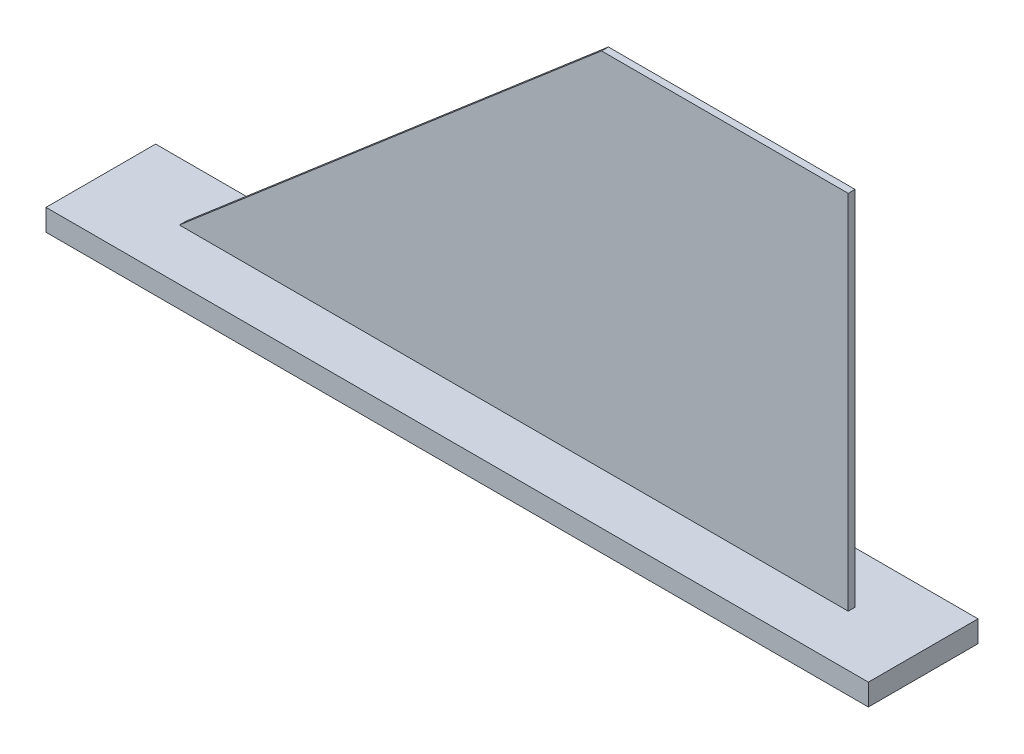
ISO-10303-21;
HEADER;
FILE_DESCRIPTION(('STEP AP214'),'2;1');
FILE_NAME('part.step','',(''),(''),'','','');
FILE_SCHEMA(('AUTOMOTIVE_DESIGN { 1 0 10303 214 1 1 1 1 }'));
ENDSEC;
DATA;
#1=APPLICATION_CONTEXT('core data for automotive mechanical design processes');
#2=APPLICATION_PROTOCOL_DEFINITION('international standard','automotive_design',2000,#1);
#3=PRODUCT_CONTEXT('',#1,'mechanical');
#4=PRODUCT('Part','Part','',(#3));
#5=PRODUCT_RELATED_PRODUCT_CATEGORY('part','',(#4));
#6=PRODUCT_DEFINITION_FORMATION('','',#4);
#7=PRODUCT_DEFINITION_CONTEXT('part definition',#1,'design');
#8=PRODUCT_DEFINITION('design','',#6,#7);
#9=PRODUCT_DEFINITION_SHAPE('','',#8);
#10=(LENGTH_UNIT() NAMED_UNIT(*) SI_UNIT(.MILLI.,.METRE.));
#11=(NAMED_UNIT(*) PLANE_ANGLE_UNIT() SI_UNIT($,.RADIAN.));
#12=(NAMED_UNIT(*) SI_UNIT($,.STERADIAN.) SOLID_ANGLE_UNIT());
#13=UNCERTAINTY_MEASURE_WITH_UNIT(LENGTH_MEASURE(1.E-05),#10,'distance_accuracy_value','');
#14=(GEOMETRIC_REPRESENTATION_CONTEXT(3) GLOBAL_UNCERTAINTY_ASSIGNED_CONTEXT((#13)) GLOBAL_UNIT_ASSIGNED_CONTEXT((#10,
#11,#12)) REPRESENTATION_CONTEXT('',''));
#15=CARTESIAN_POINT('',(0.,0.,0.));
#16=DIRECTION('',(0.,0.,1.));
#17=DIRECTION('',(1.,0.,0.));
#18=AXIS2_PLACEMENT_3D('',#15,#16,#17);
#19=CARTESIAN_POINT('',(347.8679657213,177.64,-26.9875));
#20=DIRECTION('',(1.,0.,0.));
#21=DIRECTION('',(0.,0.,-1.));
#22=AXIS2_PLACEMENT_3D('',#19,#20,#21);
#23=PLANE('',#22);
#24=DIRECTION('',(0.,0.,1.));
#25=VECTOR('',#24,1.);
#26=CARTESIAN_POINT('',(347.8679657213,177.64,-26.9875));
#27=LINE('',#26,#25);
#28=CARTESIAN_POINT('',(347.8679657213,177.64,-26.9875));
#29=VERTEX_POINT('',#28);
#30=CARTESIAN_POINT('',(347.8679657213,177.64,-23.8125));
#31=VERTEX_POINT('',#30);
#32=EDGE_CURVE('E54',#29,#31,#27,.T.);
#33=ORIENTED_EDGE('',*,*,#32,.T.);
#34=DIRECTION('',(0.,1.,0.));
#35=VECTOR('',#34,1.);
#36=CARTESIAN_POINT('',(347.8679657213,177.64,-23.8125));
#37=LINE('',#36,#35);
#38=CARTESIAN_POINT('',(347.8679657213,10.,-23.8125));
#39=VERTEX_POINT('',#38);
#40=EDGE_CURVE('E92',#39,#31,#37,.T.);
#41=ORIENTED_EDGE('',*,*,#40,.F.);
#42=DIRECTION('',(0.,0.,1.));
#43=VECTOR('',#42,1.);
#44=CARTESIAN_POINT('',(347.8679657213,10.,-26.9875));
#45=LINE('',#44,#43);
#46=CARTESIAN_POINT('',(347.8679657213,10.,-26.9875));
#47=VERTEX_POINT('',#46);
#48=EDGE_CURVE('E12',#47,#39,#45,.T.);
#49=ORIENTED_EDGE('',*,*,#48,.F.);
#50=DIRECTION('',(0.,1.,0.));
#51=VECTOR('',#50,1.);
#52=CARTESIAN_POINT('',(347.8679657213,177.64,-26.9875));
#53=LINE('',#52,#51);
#54=EDGE_CURVE('E93',#47,#29,#53,.T.);
#55=ORIENTED_EDGE('',*,*,#54,.T.);
#56=EDGE_LOOP('',(#33,#41,#49,#55));
#57=FACE_BOUND('',#56,.T.);
#58=ADVANCED_FACE('F51',(#57),#23,.T.);
#59=CARTESIAN_POINT('',(347.8679657213,10.,-26.9875));
#60=DIRECTION('',(0.,-1.,0.));
#61=DIRECTION('',(1.,0.,0.));
#62=AXIS2_PLACEMENT_3D('',#59,#60,#61);
#63=PLANE('',#62);
#64=ORIENTED_EDGE('',*,*,#48,.T.);
#65=DIRECTION('',(1.,0.,0.));
#66=VECTOR('',#65,1.);
#67=CARTESIAN_POINT('',(347.8679657213,10.,-23.8125));
#68=LINE('',#67,#66);
#69=CARTESIAN_POINT('',(37.9879657212996,10.,-23.8125));
#70=VERTEX_POINT('',#69);
#71=EDGE_CURVE('E111',#70,#39,#68,.T.);
#72=ORIENTED_EDGE('',*,*,#71,.F.);
#73=DIRECTION('',(0.,0.,1.));
#74=VECTOR('',#73,1.);
#75=CARTESIAN_POINT('',(37.9879657212996,10.,-26.9875));
#76=LINE('',#75,#74);
#77=CARTESIAN_POINT('',(37.9879657212996,10.,-26.9875));
#78=VERTEX_POINT('',#77);
#79=EDGE_CURVE('E60',#78,#70,#76,.T.);
#80=ORIENTED_EDGE('',*,*,#79,.F.);
#81=DIRECTION('',(1.,0.,0.));
#82=VECTOR('',#81,1.);
#83=CARTESIAN_POINT('',(347.8679657213,10.,-26.9875));
#84=LINE('',#83,#82);
#85=EDGE_CURVE('E99',#78,#47,#84,.T.);
#86=ORIENTED_EDGE('',*,*,#85,.T.);
#87=EDGE_LOOP('',(#64,#72,#80,#86));
#88=FACE_BOUND('',#87,.T.);
#89=ADVANCED_FACE('F135',(#88),#63,.T.);
#90=CARTESIAN_POINT('',(37.9879657212996,10.,-26.9875));
#91=DIRECTION('',(-0.650791373455968,0.759256602365296,0.));
#92=DIRECTION('',(-0.759256602365297,-0.650791373455969,0.));
#93=AXIS2_PLACEMENT_3D('',#90,#91,#92);
#94=PLANE('',#93);
#95=ORIENTED_EDGE('',*,*,#79,.T.);
#96=DIRECTION('',(-0.759256602365297,-0.650791373455969,0.));
#97=VECTOR('',#96,1.);
#98=CARTESIAN_POINT('',(37.9879657212996,10.,-23.8125));
#99=LINE('',#98,#97);
#100=CARTESIAN_POINT('',(233.5679657213,177.64,-23.8125));
#101=VERTEX_POINT('',#100);
#102=EDGE_CURVE('E107',#101,#70,#99,.T.);
#103=ORIENTED_EDGE('',*,*,#102,.F.);
#104=DIRECTION('',(0.,0.,1.));
#105=VECTOR('',#104,1.);
#106=CARTESIAN_POINT('',(233.5679657213,177.64,-26.9875));
#107=LINE('',#106,#105);
#108=CARTESIAN_POINT('',(233.5679657213,177.64,-26.9875));
#109=VERTEX_POINT('',#108);
#110=EDGE_CURVE('E98',#109,#101,#107,.T.);
#111=ORIENTED_EDGE('',*,*,#110,.F.);
#112=DIRECTION('',(-0.759256602365297,-0.650791373455969,0.));
#113=VECTOR('',#112,1.);
#114=CARTESIAN_POINT('',(37.9879657212996,10.,-26.9875));
#115=LINE('',#114,#113);
#116=EDGE_CURVE('E125',#109,#78,#115,.T.);
#117=ORIENTED_EDGE('',*,*,#116,.T.);
#118=EDGE_LOOP('',(#95,#103,#111,#117));
#119=FACE_BOUND('',#118,.T.);
#120=ADVANCED_FACE('F132',(#119),#94,.T.);
#121=CARTESIAN_POINT('',(233.5679657213,177.64,-26.9875));
#122=DIRECTION('',(0.,1.,0.));
#123=DIRECTION('',(0.,0.,1.));
#124=AXIS2_PLACEMENT_3D('',#121,#122,#123);
#125=PLANE('',#124);
#126=ORIENTED_EDGE('',*,*,#110,.T.);
#127=DIRECTION('',(-1.,0.,0.));
#128=VECTOR('',#127,1.);
#129=CARTESIAN_POINT('',(233.5679657213,177.64,-23.8125));
#130=LINE('',#129,#128);
#131=EDGE_CURVE('E101',#31,#101,#130,.T.);
#132=ORIENTED_EDGE('',*,*,#131,.F.);
#133=ORIENTED_EDGE('',*,*,#32,.F.);
#134=DIRECTION('',(-1.,0.,0.));
#135=VECTOR('',#134,1.);
#136=CARTESIAN_POINT('',(233.5679657213,177.64,-26.9875));
#137=LINE('',#136,#135);
#138=EDGE_CURVE('E122',#29,#109,#137,.T.);
#139=ORIENTED_EDGE('',*,*,#138,.T.);
#140=EDGE_LOOP('',(#126,#132,#133,#139));
#141=FACE_BOUND('',#140,.T.);
#142=ADVANCED_FACE('F102',(#141),#125,.T.);
#143=CARTESIAN_POINT('',(0.,0.,-26.9875));
#144=DIRECTION('',(0.,0.,-1.));
#145=DIRECTION('',(-1.,0.,0.));
#146=AXIS2_PLACEMENT_3D('',#143,#144,#145);
#147=PLANE('',#146);
#148=ORIENTED_EDGE('',*,*,#54,.F.);
#149=ORIENTED_EDGE('',*,*,#85,.F.);
#150=ORIENTED_EDGE('',*,*,#116,.F.);
#151=ORIENTED_EDGE('',*,*,#138,.F.);
#152=EDGE_LOOP('',(#148,#149,#150,#151));
#153=FACE_BOUND('',#152,.T.);
#154=ADVANCED_FACE('F137',(#153),#147,.T.);
#155=CARTESIAN_POINT('',(0.,0.,-23.8125));
#156=DIRECTION('',(0.,0.,-1.));
#157=DIRECTION('',(-1.,0.,0.));
#158=AXIS2_PLACEMENT_3D('',#155,#156,#157);
#159=PLANE('',#158);
#160=ORIENTED_EDGE('',*,*,#40,.T.);
#161=ORIENTED_EDGE('',*,*,#131,.T.);
#162=ORIENTED_EDGE('',*,*,#102,.T.);
#163=ORIENTED_EDGE('',*,*,#71,.T.);
#164=EDGE_LOOP('',(#160,#161,#162,#163));
#165=FACE_BOUND('',#164,.T.);
#166=ADVANCED_FACE('F110',(#165),#159,.F.);
#167=CLOSED_SHELL('',(#58,#89,#120,#142,#154,#166));
#168=MANIFOLD_SOLID_BREP('B2',#167);
#169=CARTESIAN_POINT('',(0.,10.,0.));
#170=DIRECTION('',(1.,0.,0.));
#171=DIRECTION('',(0.,0.,-1.));
#172=AXIS2_PLACEMENT_3D('',#169,#170,#171);
#173=PLANE('',#172);
#174=DIRECTION('',(0.,0.,1.));
#175=VECTOR('',#174,1.);
#176=CARTESIAN_POINT('',(0.,0.,0.));
#177=LINE('',#176,#175);
#178=CARTESIAN_POINT('',(0.,0.,-50.8));
#179=VERTEX_POINT('',#178);
#180=CARTESIAN_POINT('',(0.,0.,0.));
#181=VERTEX_POINT('',#180);
#182=EDGE_CURVE('E274',#179,#181,#177,.T.);
#183=ORIENTED_EDGE('',*,*,#182,.T.);
#184=DIRECTION('',(0.,-1.,0.));
#185=VECTOR('',#184,1.);
#186=CARTESIAN_POINT('',(0.,10.,0.));
#187=LINE('',#186,#185);
#188=CARTESIAN_POINT('',(0.,10.,0.));
#189=VERTEX_POINT('',#188);
#190=EDGE_CURVE('E49',#189,#181,#187,.T.);
#191=ORIENTED_EDGE('',*,*,#190,.F.);
#192=DIRECTION('',(0.,0.,1.));
#193=VECTOR('',#192,1.);
#194=CARTESIAN_POINT('',(0.,10.,0.));
#195=LINE('',#194,#193);
#196=CARTESIAN_POINT('',(0.,10.,-50.8));
#197=VERTEX_POINT('',#196);
#198=EDGE_CURVE('E256',#197,#189,#195,.T.);
#199=ORIENTED_EDGE('',*,*,#198,.F.);
#200=DIRECTION('',(0.,-1.,0.));
#201=VECTOR('',#200,1.);
#202=CARTESIAN_POINT('',(0.,10.,-50.8));
#203=LINE('',#202,#201);
#204=EDGE_CURVE('E270',#197,#179,#203,.T.);
#205=ORIENTED_EDGE('',*,*,#204,.T.);
#206=EDGE_LOOP('',(#183,#191,#199,#205));
#207=FACE_BOUND('',#206,.T.);
#208=ADVANCED_FACE('F204',(#207),#173,.F.);
#209=CARTESIAN_POINT('',(0.,10.,0.));
#210=DIRECTION('',(0.,0.,-1.));
#211=DIRECTION('',(-1.,0.,0.));
#212=AXIS2_PLACEMENT_3D('',#209,#210,#211);
#213=PLANE('',#212);
#214=DIRECTION('',(1.,0.,0.));
#215=VECTOR('',#214,1.);
#216=CARTESIAN_POINT('',(0.,0.,0.));
#217=LINE('',#216,#215);
#218=CARTESIAN_POINT('',(381.,0.,0.));
#219=VERTEX_POINT('',#218);
#220=EDGE_CURVE('E261',#181,#219,#217,.T.);
#221=ORIENTED_EDGE('',*,*,#220,.T.);
#222=DIRECTION('',(0.,-1.,0.));
#223=VECTOR('',#222,1.);
#224=CARTESIAN_POINT('',(381.,10.,0.));
#225=LINE('',#224,#223);
#226=CARTESIAN_POINT('',(381.,10.,0.));
#227=VERTEX_POINT('',#226);
#228=EDGE_CURVE('E213',#227,#219,#225,.T.);
#229=ORIENTED_EDGE('',*,*,#228,.F.);
#230=DIRECTION('',(1.,0.,0.));
#231=VECTOR('',#230,1.);
#232=CARTESIAN_POINT('',(0.,10.,0.));
#233=LINE('',#232,#231);
#234=EDGE_CURVE('E251',#189,#227,#233,.T.);
#235=ORIENTED_EDGE('',*,*,#234,.F.);
#236=ORIENTED_EDGE('',*,*,#190,.T.);
#237=EDGE_LOOP('',(#221,#229,#235,#236));
#238=FACE_BOUND('',#237,.T.);
#239=ADVANCED_FACE('F260',(#238),#213,.F.);
#240=CARTESIAN_POINT('',(381.,10.,0.));
#241=DIRECTION('',(-1.,0.,0.));
#242=DIRECTION('',(0.,0.,1.));
#243=AXIS2_PLACEMENT_3D('',#240,#241,#242);
#244=PLANE('',#243);
#245=DIRECTION('',(0.,0.,-1.));
#246=VECTOR('',#245,1.);
#247=CARTESIAN_POINT('',(381.,0.,0.));
#248=LINE('',#247,#246);
#249=CARTESIAN_POINT('',(381.,0.,-50.8));
#250=VERTEX_POINT('',#249);
#251=EDGE_CURVE('E238',#219,#250,#248,.T.);
#252=ORIENTED_EDGE('',*,*,#251,.T.);
#253=DIRECTION('',(0.,-1.,0.));
#254=VECTOR('',#253,1.);
#255=CARTESIAN_POINT('',(381.,10.,-50.8));
#256=LINE('',#255,#254);
#257=CARTESIAN_POINT('',(381.,10.,-50.8));
#258=VERTEX_POINT('',#257);
#259=EDGE_CURVE('E263',#258,#250,#256,.T.);
#260=ORIENTED_EDGE('',*,*,#259,.F.);
#261=DIRECTION('',(0.,0.,-1.));
#262=VECTOR('',#261,1.);
#263=CARTESIAN_POINT('',(381.,10.,0.));
#264=LINE('',#263,#262);
#265=EDGE_CURVE('E254',#227,#258,#264,.T.);
#266=ORIENTED_EDGE('',*,*,#265,.F.);
#267=ORIENTED_EDGE('',*,*,#228,.T.);
#268=EDGE_LOOP('',(#252,#260,#266,#267));
#269=FACE_BOUND('',#268,.T.);
#270=ADVANCED_FACE('F264',(#269),#244,.F.);
#271=CARTESIAN_POINT('',(0.,10.,-50.8));
#272=DIRECTION('',(0.,0.,1.));
#273=DIRECTION('',(1.,0.,0.));
#274=AXIS2_PLACEMENT_3D('',#271,#272,#273);
#275=PLANE('',#274);
#276=DIRECTION('',(-1.,0.,0.));
#277=VECTOR('',#276,1.);
#278=CARTESIAN_POINT('',(0.,0.,-50.8));
#279=LINE('',#278,#277);
#280=EDGE_CURVE('E244',#250,#179,#279,.T.);
#281=ORIENTED_EDGE('',*,*,#280,.T.);
#282=ORIENTED_EDGE('',*,*,#204,.F.);
#283=DIRECTION('',(-1.,0.,0.));
#284=VECTOR('',#283,1.);
#285=CARTESIAN_POINT('',(0.,10.,-50.8));
#286=LINE('',#285,#284);
#287=EDGE_CURVE('E221',#258,#197,#286,.T.);
#288=ORIENTED_EDGE('',*,*,#287,.F.);
#289=ORIENTED_EDGE('',*,*,#259,.T.);
#290=EDGE_LOOP('',(#281,#282,#288,#289));
#291=FACE_BOUND('',#290,.T.);
#292=ADVANCED_FACE('F286',(#291),#275,.F.);
#293=CARTESIAN_POINT('',(0.,10.,0.));
#294=DIRECTION('',(0.,-1.,0.));
#295=DIRECTION('',(0.,0.,-1.));
#296=AXIS2_PLACEMENT_3D('',#293,#294,#295);
#297=PLANE('',#296);
#298=ORIENTED_EDGE('',*,*,#198,.T.);
#299=ORIENTED_EDGE('',*,*,#234,.T.);
#300=ORIENTED_EDGE('',*,*,#265,.T.);
#301=ORIENTED_EDGE('',*,*,#287,.T.);
#302=EDGE_LOOP('',(#298,#299,#300,#301));
#303=FACE_BOUND('',#302,.T.);
#304=ADVANCED_FACE('F252',(#303),#297,.F.);
#305=CARTESIAN_POINT('',(0.,0.,0.));
#306=DIRECTION('',(0.,-1.,0.));
#307=DIRECTION('',(0.,0.,-1.));
#308=AXIS2_PLACEMENT_3D('',#305,#306,#307);
#309=PLANE('',#308);
#310=ORIENTED_EDGE('',*,*,#182,.F.);
#311=ORIENTED_EDGE('',*,*,#280,.F.);
#312=ORIENTED_EDGE('',*,*,#251,.F.);
#313=ORIENTED_EDGE('',*,*,#220,.F.);
#314=EDGE_LOOP('',(#310,#311,#312,#313));
#315=FACE_BOUND('',#314,.T.);
#316=ADVANCED_FACE('F289',(#315),#309,.T.);
#317=CLOSED_SHELL('',(#208,#239,#270,#292,#304,#316));
#318=MANIFOLD_SOLID_BREP('B6',#317);
#319=ADVANCED_BREP_SHAPE_REPRESENTATION('',(#18,#168,#318),#14);
#320=SHAPE_DEFINITION_REPRESENTATION(#9,#319);
ENDSEC;
END-ISO-10303-21;
